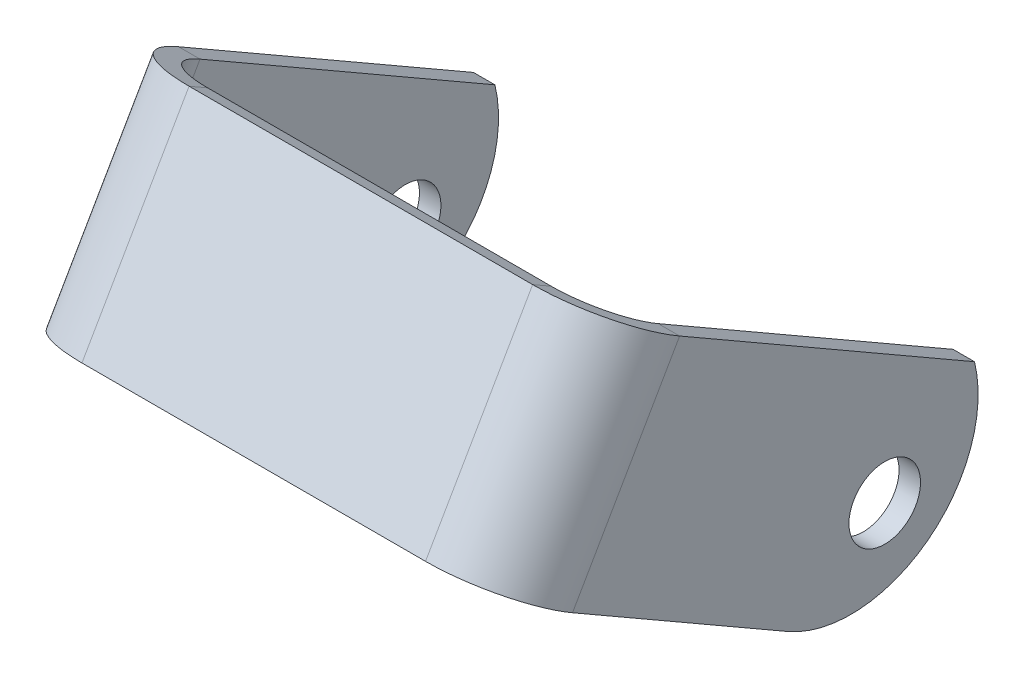
ISO-10303-21;
HEADER;
FILE_DESCRIPTION(('STEP AP214'),'2;1');
FILE_NAME('part.step','',(''),(''),'','','');
FILE_SCHEMA(('AUTOMOTIVE_DESIGN { 1 0 10303 214 1 1 1 1 }'));
ENDSEC;
DATA;
#1=APPLICATION_CONTEXT('core data for automotive mechanical design processes');
#2=APPLICATION_PROTOCOL_DEFINITION('international standard','automotive_design',2000,#1);
#3=PRODUCT_CONTEXT('',#1,'mechanical');
#4=PRODUCT('Part','Part','',(#3));
#5=PRODUCT_RELATED_PRODUCT_CATEGORY('part','',(#4));
#6=PRODUCT_DEFINITION_FORMATION('','',#4);
#7=PRODUCT_DEFINITION_CONTEXT('part definition',#1,'design');
#8=PRODUCT_DEFINITION('design','',#6,#7);
#9=PRODUCT_DEFINITION_SHAPE('','',#8);
#10=(LENGTH_UNIT() NAMED_UNIT(*) SI_UNIT(.MILLI.,.METRE.));
#11=(NAMED_UNIT(*) PLANE_ANGLE_UNIT() SI_UNIT($,.RADIAN.));
#12=(NAMED_UNIT(*) SI_UNIT($,.STERADIAN.) SOLID_ANGLE_UNIT());
#13=UNCERTAINTY_MEASURE_WITH_UNIT(LENGTH_MEASURE(1.E-05),#10,'distance_accuracy_value','');
#14=(GEOMETRIC_REPRESENTATION_CONTEXT(3) GLOBAL_UNCERTAINTY_ASSIGNED_CONTEXT((#13)) GLOBAL_UNIT_ASSIGNED_CONTEXT((#10,
#11,#12)) REPRESENTATION_CONTEXT('',''));
#15=CARTESIAN_POINT('',(0.,0.,0.));
#16=DIRECTION('',(0.,0.,1.));
#17=DIRECTION('',(1.,0.,0.));
#18=AXIS2_PLACEMENT_3D('',#15,#16,#17);
#19=CARTESIAN_POINT('',(17.5000000000001,-13.1983253106158,-48.8391520352316));
#20=DIRECTION('',(0.,0.866730126648501,-0.498777392791487));
#21=DIRECTION('',(0.,0.498777392791487,0.866730126648501));
#22=AXIS2_PLACEMENT_3D('',#19,#20,#21);
#23=PLANE('',#22);
#24=DIRECTION('',(1.,0.,0.));
#25=VECTOR('',#24,1.);
#26=CARTESIAN_POINT('',(-17.5000000000002,-4.38561215621674,-33.5252182065939));
#27=LINE('',#26,#25);
#28=CARTESIAN_POINT('',(16.0000000000001,-4.38561215621668,-33.5252182065938));
#29=VERTEX_POINT('',#28);
#30=CARTESIAN_POINT('',(17.5000000000001,-4.38561215621668,-33.5252182065938));
#31=VERTEX_POINT('',#30);
#32=EDGE_CURVE('E57',#29,#31,#27,.T.);
#33=ORIENTED_EDGE('',*,*,#32,.T.);
#34=DIRECTION('',(0.,-0.498777392791487,-0.866730126648501));
#35=VECTOR('',#34,1.);
#36=CARTESIAN_POINT('',(17.5000000000001,-13.1983253106158,-48.8391520352316));
#37=LINE('',#36,#35);
#38=CARTESIAN_POINT('',(17.5,4.25888343708619,-18.5035976025341));
#39=VERTEX_POINT('',#38);
#40=EDGE_CURVE('E180',#39,#31,#37,.T.);
#41=ORIENTED_EDGE('',*,*,#40,.F.);
#42=DIRECTION('',(1.,0.,0.));
#43=VECTOR('',#42,1.);
#44=CARTESIAN_POINT('',(16.,4.25888343708618,-18.5035976025341));
#45=LINE('',#44,#43);
#46=CARTESIAN_POINT('',(16.,4.25888343708618,-18.5035976025341));
#47=VERTEX_POINT('',#46);
#48=EDGE_CURVE('E255',#47,#39,#45,.T.);
#49=ORIENTED_EDGE('',*,*,#48,.F.);
#50=DIRECTION('',(0.,-0.498777392791487,-0.866730126648501));
#51=VECTOR('',#50,1.);
#52=CARTESIAN_POINT('',(16.0000000000001,-13.1983253106159,-48.8391520352316));
#53=LINE('',#52,#51);
#54=EDGE_CURVE('E172',#47,#29,#53,.T.);
#55=ORIENTED_EDGE('',*,*,#54,.T.);
#56=EDGE_LOOP('',(#33,#41,#49,#55));
#57=FACE_BOUND('',#56,.T.);
#58=ADVANCED_FACE('F39',(#57),#23,.F.);
#59=CARTESIAN_POINT('',(-17.5,6.25399300825214,-15.0366770959401));
#60=DIRECTION('',(0.,0.866730126648501,-0.498777392791487));
#61=DIRECTION('',(0.,0.498777392791487,0.866730126648501));
#62=AXIS2_PLACEMENT_3D('',#59,#60,#61);
#63=PLANE('',#62);
#64=CARTESIAN_POINT('',(-17.5000000000002,-4.38561215621674,-33.5252182065939));
#65=VERTEX_POINT('',#64);
#66=CARTESIAN_POINT('',(-16.0000000000001,-4.38561215621674,-33.5252182065939));
#67=VERTEX_POINT('',#66);
#68=EDGE_CURVE('E75',#65,#67,#27,.T.);
#69=ORIENTED_EDGE('',*,*,#68,.T.);
#70=DIRECTION('',(0.,0.498777392791487,0.866730126648501));
#71=VECTOR('',#70,1.);
#72=CARTESIAN_POINT('',(-16.,6.25399300825214,-15.0366770959401));
#73=LINE('',#72,#71);
#74=CARTESIAN_POINT('',(-16.,4.25888343708619,-18.5035976025341));
#75=VERTEX_POINT('',#74);
#76=EDGE_CURVE('E227',#67,#75,#73,.T.);
#77=ORIENTED_EDGE('',*,*,#76,.T.);
#78=DIRECTION('',(-1.,0.,0.));
#79=VECTOR('',#78,1.);
#80=CARTESIAN_POINT('',(-16.,4.25888343708619,-18.5035976025341));
#81=LINE('',#80,#79);
#82=CARTESIAN_POINT('',(-17.5,4.25888343708619,-18.5035976025341));
#83=VERTEX_POINT('',#82);
#84=EDGE_CURVE('E214',#75,#83,#81,.T.);
#85=ORIENTED_EDGE('',*,*,#84,.T.);
#86=DIRECTION('',(0.,0.498777392791487,0.866730126648501));
#87=VECTOR('',#86,1.);
#88=CARTESIAN_POINT('',(-17.5,6.25399300825214,-15.0366770959401));
#89=LINE('',#88,#87);
#90=EDGE_CURVE('E226',#65,#83,#89,.T.);
#91=ORIENTED_EDGE('',*,*,#90,.F.);
#92=EDGE_LOOP('',(#69,#77,#85,#91));
#93=FACE_BOUND('',#92,.T.);
#94=ADVANCED_FACE('F289',(#93),#63,.F.);
#95=CARTESIAN_POINT('',(-16.,19.2549449079796,-22.5183379878124));
#96=DIRECTION('',(0.,0.498777392791487,0.866730126648501));
#97=DIRECTION('',(0.,-0.866730126648501,0.498777392791487));
#98=AXIS2_PLACEMENT_3D('',#95,#96,#97);
#99=PLANE('',#98);
#100=DIRECTION('',(0.,0.866730126648501,-0.498777392791487));
#101=VECTOR('',#100,1.);
#102=CARTESIAN_POINT('',(-12.,19.2549449079796,-22.5183379878124));
#103=LINE('',#102,#101);
#104=CARTESIAN_POINT('',(-12.,19.2549449079796,-22.5183379878124));
#105=VERTEX_POINT('',#104);
#106=CARTESIAN_POINT('',(-12.,6.25399300825213,-15.0366770959401));
#107=VERTEX_POINT('',#106);
#108=EDGE_CURVE('E244',#105,#107,#103,.F.);
#109=ORIENTED_EDGE('',*,*,#108,.F.);
#110=DIRECTION('',(1.,0.,0.));
#111=VECTOR('',#110,1.);
#112=CARTESIAN_POINT('',(-16.,19.2549449079796,-22.5183379878124));
#113=LINE('',#112,#111);
#114=CARTESIAN_POINT('',(12.,19.2549449079796,-22.5183379878124));
#115=VERTEX_POINT('',#114);
#116=EDGE_CURVE('E183',#105,#115,#113,.T.);
#117=ORIENTED_EDGE('',*,*,#116,.T.);
#118=DIRECTION('',(0.,-0.866730126648502,0.498777392791486));
#119=VECTOR('',#118,1.);
#120=CARTESIAN_POINT('',(12.,6.25399300825212,-15.0366770959401));
#121=LINE('',#120,#119);
#122=CARTESIAN_POINT('',(12.,6.25399300825212,-15.0366770959401));
#123=VERTEX_POINT('',#122);
#124=EDGE_CURVE('E176',#123,#115,#121,.F.);
#125=ORIENTED_EDGE('',*,*,#124,.F.);
#126=DIRECTION('',(1.,0.,0.));
#127=VECTOR('',#126,1.);
#128=CARTESIAN_POINT('',(-16.,6.25399300825214,-15.0366770959401));
#129=LINE('',#128,#127);
#130=EDGE_CURVE('E49',#107,#123,#129,.T.);
#131=ORIENTED_EDGE('',*,*,#130,.F.);
#132=EDGE_LOOP('',(#109,#117,#125,#131));
#133=FACE_BOUND('',#132,.T.);
#134=ADVANCED_FACE('F322',(#133),#99,.F.);
#135=CARTESIAN_POINT('',(-16.,20.0031109971669,-21.2182427978396));
#136=DIRECTION('',(0.,0.498777392791487,0.866730126648501));
#137=DIRECTION('',(0.,-0.866730126648501,0.498777392791487));
#138=AXIS2_PLACEMENT_3D('',#135,#136,#137);
#139=PLANE('',#138);
#140=DIRECTION('',(1.,0.,0.));
#141=VECTOR('',#140,1.);
#142=CARTESIAN_POINT('',(-16.,20.0031109971669,-21.2182427978396));
#143=LINE('',#142,#141);
#144=CARTESIAN_POINT('',(-12.,20.0031109971669,-21.2182427978396));
#145=VERTEX_POINT('',#144);
#146=CARTESIAN_POINT('',(12.,20.0031109971669,-21.2182427978396));
#147=VERTEX_POINT('',#146);
#148=EDGE_CURVE('E154',#145,#147,#143,.T.);
#149=ORIENTED_EDGE('',*,*,#148,.F.);
#150=DIRECTION('',(0.,0.866730126648501,-0.498777392791487));
#151=VECTOR('',#150,1.);
#152=CARTESIAN_POINT('',(-12.,20.0031109971669,-21.2182427978396));
#153=LINE('',#152,#151);
#154=CARTESIAN_POINT('',(-12.,7.00215909743937,-13.7365819059673));
#155=VERTEX_POINT('',#154);
#156=EDGE_CURVE('E233',#145,#155,#153,.F.);
#157=ORIENTED_EDGE('',*,*,#156,.T.);
#158=DIRECTION('',(1.,0.,0.));
#159=VECTOR('',#158,1.);
#160=CARTESIAN_POINT('',(-16.,7.00215909743937,-13.7365819059673));
#161=LINE('',#160,#159);
#162=CARTESIAN_POINT('',(12.,7.00215909743935,-13.7365819059673));
#163=VERTEX_POINT('',#162);
#164=EDGE_CURVE('E162',#155,#163,#161,.T.);
#165=ORIENTED_EDGE('',*,*,#164,.T.);
#166=DIRECTION('',(0.,-0.866730126648502,0.498777392791486));
#167=VECTOR('',#166,1.);
#168=CARTESIAN_POINT('',(12.,7.00215909743935,-13.7365819059673));
#169=LINE('',#168,#167);
#170=EDGE_CURVE('E135',#163,#147,#169,.F.);
#171=ORIENTED_EDGE('',*,*,#170,.T.);
#172=EDGE_LOOP('',(#149,#157,#165,#171));
#173=FACE_BOUND('',#172,.T.);
#174=ADVANCED_FACE('F165',(#173),#139,.T.);
#175=CARTESIAN_POINT('',(-16.,19.2549449079796,-22.5183379878124));
#176=DIRECTION('',(0.,-0.866730126648501,0.498777392791487));
#177=DIRECTION('',(1.,0.,0.));
#178=AXIS2_PLACEMENT_3D('',#175,#176,#177);
#179=PLANE('',#178);
#180=ORIENTED_EDGE('',*,*,#116,.F.);
#181=DIRECTION('',(0.,0.498777392791487,0.866730126648501));
#182=VECTOR('',#181,1.);
#183=CARTESIAN_POINT('',(-12.,19.2549449079796,-22.5183379878124));
#184=LINE('',#183,#182);
#185=EDGE_CURVE('E159',#105,#145,#184,.T.);
#186=ORIENTED_EDGE('',*,*,#185,.T.);
#187=ORIENTED_EDGE('',*,*,#148,.T.);
#188=DIRECTION('',(0.,0.498777392791486,0.866730126648502));
#189=VECTOR('',#188,1.);
#190=CARTESIAN_POINT('',(12.,19.2549449079796,-22.5183379878124));
#191=LINE('',#190,#189);
#192=EDGE_CURVE('E146',#115,#147,#191,.T.);
#193=ORIENTED_EDGE('',*,*,#192,.F.);
#194=EDGE_LOOP('',(#180,#186,#187,#193));
#195=FACE_BOUND('',#194,.T.);
#196=ADVANCED_FACE('F158',(#195),#179,.F.);
#197=CARTESIAN_POINT('',(-16.,6.25399300825214,-15.0366770959401));
#198=DIRECTION('',(0.,-0.866730126648501,0.498777392791487));
#199=DIRECTION('',(1.,0.,0.));
#200=AXIS2_PLACEMENT_3D('',#197,#198,#199);
#201=PLANE('',#200);
#202=DIRECTION('',(0.,0.498777392791488,0.866730126648501));
#203=VECTOR('',#202,1.);
#204=CARTESIAN_POINT('',(-12.,6.25399300825213,-15.0366770959401));
#205=LINE('',#204,#203);
#206=EDGE_CURVE('E248',#107,#155,#205,.T.);
#207=ORIENTED_EDGE('',*,*,#206,.F.);
#208=ORIENTED_EDGE('',*,*,#130,.T.);
#209=DIRECTION('',(0.,0.498777392791486,0.866730126648502));
#210=VECTOR('',#209,1.);
#211=CARTESIAN_POINT('',(12.,6.25399300825212,-15.0366770959401));
#212=LINE('',#211,#210);
#213=EDGE_CURVE('E142',#123,#163,#212,.T.);
#214=ORIENTED_EDGE('',*,*,#213,.T.);
#215=ORIENTED_EDGE('',*,*,#164,.F.);
#216=EDGE_LOOP('',(#207,#208,#214,#215));
#217=FACE_BOUND('',#216,.T.);
#218=ADVANCED_FACE('F41',(#217),#201,.T.);
#219=CARTESIAN_POINT('',(12.,17.2598353368137,-25.9852584944064));
#220=DIRECTION('',(0.,0.866730126648502,-0.498777392791486));
#221=DIRECTION('',(0.,0.498777392791486,0.866730126648502));
#222=AXIS2_PLACEMENT_3D('',#219,#220,#221);
#223=PLANE('',#222);
#224=DIRECTION('',(1.,0.,0.));
#225=VECTOR('',#224,1.);
#226=CARTESIAN_POINT('',(16.,17.2598353368137,-25.9852584944064));
#227=LINE('',#226,#225);
#228=CARTESIAN_POINT('',(16.,17.2598353368137,-25.9852584944064));
#229=VERTEX_POINT('',#228);
#230=CARTESIAN_POINT('',(17.5,17.2598353368137,-25.9852584944064));
#231=VERTEX_POINT('',#230);
#232=EDGE_CURVE('E251',#229,#231,#227,.T.);
#233=ORIENTED_EDGE('',*,*,#232,.F.);
#234=CARTESIAN_POINT('',(12.,17.2598353368137,-25.9852584944064));
#235=DIRECTION('',(0.,-0.866730126648502,0.498777392791486));
#236=DIRECTION('',(0.,-0.498777392791486,-0.866730126648502));
#237=AXIS2_PLACEMENT_3D('',#234,#235,#236);
#238=CIRCLE('',#237,4.);
#239=EDGE_CURVE('E150',#115,#229,#238,.F.);
#240=ORIENTED_EDGE('',*,*,#239,.F.);
#241=ORIENTED_EDGE('',*,*,#192,.T.);
#242=CARTESIAN_POINT('',(12.,17.2598353368137,-25.9852584944064));
#243=DIRECTION('',(0.,-0.866730126648502,0.498777392791486));
#244=DIRECTION('',(0.,-0.498777392791486,-0.866730126648502));
#245=AXIS2_PLACEMENT_3D('',#242,#243,#244);
#246=CIRCLE('',#245,5.5);
#247=EDGE_CURVE('E131',#147,#231,#246,.F.);
#248=ORIENTED_EDGE('',*,*,#247,.T.);
#249=EDGE_LOOP('',(#233,#240,#241,#248));
#250=FACE_BOUND('',#249,.T.);
#251=ADVANCED_FACE('F148',(#250),#223,.T.);
#252=CARTESIAN_POINT('',(12.,4.25888343708618,-18.5035976025341));
#253=DIRECTION('',(0.,0.866730126648502,-0.498777392791486));
#254=DIRECTION('',(0.,0.498777392791486,0.866730126648502));
#255=AXIS2_PLACEMENT_3D('',#252,#253,#254);
#256=PLANE('',#255);
#257=CARTESIAN_POINT('',(12.,4.25888343708618,-18.5035976025341));
#258=DIRECTION('',(0.,-0.866730126648502,0.498777392791486));
#259=DIRECTION('',(0.,-0.498777392791486,-0.866730126648502));
#260=AXIS2_PLACEMENT_3D('',#257,#258,#259);
#261=CIRCLE('',#260,4.);
#262=EDGE_CURVE('E178',#47,#123,#261,.T.);
#263=ORIENTED_EDGE('',*,*,#262,.F.);
#264=ORIENTED_EDGE('',*,*,#48,.T.);
#265=CARTESIAN_POINT('',(12.,4.25888343708618,-18.5035976025341));
#266=DIRECTION('',(0.,-0.866730126648502,0.498777392791486));
#267=DIRECTION('',(0.,-0.498777392791486,-0.866730126648502));
#268=AXIS2_PLACEMENT_3D('',#265,#266,#267);
#269=CIRCLE('',#268,5.5);
#270=EDGE_CURVE('E168',#39,#163,#269,.T.);
#271=ORIENTED_EDGE('',*,*,#270,.T.);
#272=ORIENTED_EDGE('',*,*,#213,.F.);
#273=EDGE_LOOP('',(#263,#264,#271,#272));
#274=FACE_BOUND('',#273,.T.);
#275=ADVANCED_FACE('F318',(#274),#256,.F.);
#276=CARTESIAN_POINT('',(12.,4.25888343708617,-18.5035976025341));
#277=DIRECTION('',(0.,-0.866730126648502,0.498777392791486));
#278=DIRECTION('',(1.,0.,0.));
#279=AXIS2_PLACEMENT_3D('',#276,#277,#278);
#280=CYLINDRICAL_SURFACE('',#279,5.5);
#281=ORIENTED_EDGE('',*,*,#170,.F.);
#282=ORIENTED_EDGE('',*,*,#270,.F.);
#283=DIRECTION('',(0.,0.866730126648502,-0.498777392791486));
#284=VECTOR('',#283,1.);
#285=CARTESIAN_POINT('',(17.5,-6.93968474648737,-12.0591548978608));
#286=LINE('',#285,#284);
#287=EDGE_CURVE('E138',#39,#231,#286,.T.);
#288=ORIENTED_EDGE('',*,*,#287,.T.);
#289=ORIENTED_EDGE('',*,*,#247,.F.);
#290=EDGE_LOOP('',(#281,#282,#288,#289));
#291=FACE_BOUND('',#290,.T.);
#292=ADVANCED_FACE('F133',(#291),#280,.T.);
#293=CARTESIAN_POINT('',(12.,4.25888343708617,-18.5035976025341));
#294=DIRECTION('',(0.,-0.866730126648502,0.498777392791486));
#295=DIRECTION('',(1.,0.,0.));
#296=AXIS2_PLACEMENT_3D('',#293,#294,#295);
#297=CYLINDRICAL_SURFACE('',#296,4.);
#298=ORIENTED_EDGE('',*,*,#124,.T.);
#299=ORIENTED_EDGE('',*,*,#239,.T.);
#300=DIRECTION('',(0.,-0.866730126648501,0.498777392791486));
#301=VECTOR('',#300,1.);
#302=CARTESIAN_POINT('',(16.,17.2598353368137,-25.9852584944064));
#303=LINE('',#302,#301);
#304=EDGE_CURVE('E253',#229,#47,#303,.T.);
#305=ORIENTED_EDGE('',*,*,#304,.T.);
#306=ORIENTED_EDGE('',*,*,#262,.T.);
#307=EDGE_LOOP('',(#298,#299,#305,#306));
#308=FACE_BOUND('',#307,.T.);
#309=ADVANCED_FACE('F320',(#308),#297,.F.);
#310=CARTESIAN_POINT('',(17.5,19.2549449079796,-22.5183379878124));
#311=DIRECTION('',(0.,-0.866730126648501,0.498777392791487));
#312=DIRECTION('',(0.,-0.498777392791487,-0.866730126648501));
#313=AXIS2_PLACEMENT_3D('',#310,#311,#312);
#314=PLANE('',#313);
#315=DIRECTION('',(0.,0.498777392791487,0.866730126648501));
#316=VECTOR('',#315,1.);
#317=CARTESIAN_POINT('',(17.5,19.2549449079796,-22.5183379878124));
#318=LINE('',#317,#316);
#319=CARTESIAN_POINT('',(17.5000000000001,5.40620403509819,-46.58342414478));
#320=VERTEX_POINT('',#319);
#321=EDGE_CURVE('E261',#320,#231,#318,.T.);
#322=ORIENTED_EDGE('',*,*,#321,.F.);
#323=DIRECTION('',(1.,0.,0.));
#324=VECTOR('',#323,1.);
#325=CARTESIAN_POINT('',(-17.5000000000002,5.40620403509812,-46.5834241447801));
#326=LINE('',#325,#324);
#327=CARTESIAN_POINT('',(16.0000000000001,5.40620403509818,-46.58342414478));
#328=VERTEX_POINT('',#327);
#329=EDGE_CURVE('E66',#328,#320,#326,.T.);
#330=ORIENTED_EDGE('',*,*,#329,.F.);
#331=DIRECTION('',(0.,0.498777392791487,0.866730126648501));
#332=VECTOR('',#331,1.);
#333=CARTESIAN_POINT('',(16.,19.2549449079796,-22.5183379878124));
#334=LINE('',#333,#332);
#335=EDGE_CURVE('E260',#328,#229,#334,.T.);
#336=ORIENTED_EDGE('',*,*,#335,.T.);
#337=ORIENTED_EDGE('',*,*,#232,.T.);
#338=EDGE_LOOP('',(#322,#330,#336,#337));
#339=FACE_BOUND('',#338,.T.);
#340=ADVANCED_FACE('F277',(#339),#314,.F.);
#341=CARTESIAN_POINT('',(17.5,0.,0.));
#342=DIRECTION('',(-1.,0.,0.));
#343=DIRECTION('',(0.,0.,1.));
#344=AXIS2_PLACEMENT_3D('',#341,#342,#343);
#345=PLANE('',#344);
#346=CARTESIAN_POINT('',(17.5000000000001,0.,-40.3124294068874));
#347=DIRECTION('',(-1.,0.,0.));
#348=DIRECTION('',(0.,0.,1.));
#349=AXIS2_PLACEMENT_3D('',#346,#347,#348);
#350=CIRCLE('',#349,2.5);
#351=CARTESIAN_POINT('',(17.5000000000001,0.,-37.8124294068874));
#352=VERTEX_POINT('',#351);
#353=EDGE_CURVE('E195',#352,#352,#350,.T.);
#354=ORIENTED_EDGE('',*,*,#353,.T.);
#355=EDGE_LOOP('',(#354));
#356=FACE_BOUND('',#355,.T.);
#357=ORIENTED_EDGE('',*,*,#40,.T.);
#358=CARTESIAN_POINT('',(17.5000000000001,3.31084755289087,-37.9543017118338));
#359=DIRECTION('',(1.,0.,0.));
#360=DIRECTION('',(0.,0.,-1.));
#361=AXIS2_PLACEMENT_3D('',#358,#359,#360);
#362=CIRCLE('',#361,8.87988022161922);
#363=EDGE_CURVE('E43',#320,#31,#362,.F.);
#364=ORIENTED_EDGE('',*,*,#363,.F.);
#365=ORIENTED_EDGE('',*,*,#321,.T.);
#366=ORIENTED_EDGE('',*,*,#287,.F.);
#367=EDGE_LOOP('',(#357,#364,#365,#366));
#368=FACE_BOUND('',#367,.T.);
#369=ADVANCED_FACE('F341',(#356,#368),#345,.F.);
#370=CARTESIAN_POINT('',(16.,0.,0.));
#371=DIRECTION('',(-1.,0.,0.));
#372=DIRECTION('',(0.,0.,1.));
#373=AXIS2_PLACEMENT_3D('',#370,#371,#372);
#374=PLANE('',#373);
#375=CARTESIAN_POINT('',(16.0000000000001,3.31084755289087,-37.9543017118338));
#376=DIRECTION('',(-1.,0.,0.));
#377=DIRECTION('',(0.,0.,1.));
#378=AXIS2_PLACEMENT_3D('',#375,#376,#377);
#379=CIRCLE('',#378,8.87988022161922);
#380=EDGE_CURVE('E209',#29,#328,#379,.F.);
#381=ORIENTED_EDGE('',*,*,#380,.F.);
#382=ORIENTED_EDGE('',*,*,#54,.F.);
#383=ORIENTED_EDGE('',*,*,#304,.F.);
#384=ORIENTED_EDGE('',*,*,#335,.F.);
#385=EDGE_LOOP('',(#381,#382,#383,#384));
#386=FACE_BOUND('',#385,.T.);
#387=CARTESIAN_POINT('',(16.0000000000001,0.,-40.3124294068874));
#388=DIRECTION('',(-1.,0.,0.));
#389=DIRECTION('',(0.,0.,1.));
#390=AXIS2_PLACEMENT_3D('',#387,#388,#389);
#391=CIRCLE('',#390,2.5);
#392=CARTESIAN_POINT('',(16.0000000000001,0.,-37.8124294068874));
#393=VERTEX_POINT('',#392);
#394=EDGE_CURVE('E190',#393,#393,#391,.T.);
#395=ORIENTED_EDGE('',*,*,#394,.F.);
#396=EDGE_LOOP('',(#395));
#397=FACE_BOUND('',#396,.T.);
#398=ADVANCED_FACE('F273',(#386,#397),#374,.T.);
#399=CARTESIAN_POINT('',(-12.,4.25888343708619,-18.5035976025341));
#400=DIRECTION('',(0.,-0.866730126648501,0.498777392791487));
#401=DIRECTION('',(0.,-0.498777392791487,-0.866730126648501));
#402=AXIS2_PLACEMENT_3D('',#399,#400,#401);
#403=PLANE('',#402);
#404=ORIENTED_EDGE('',*,*,#84,.F.);
#405=CARTESIAN_POINT('',(-12.,4.25888343708619,-18.5035976025341));
#406=DIRECTION('',(0.,0.866730126648501,-0.498777392791487));
#407=DIRECTION('',(0.,0.498777392791487,0.866730126648501));
#408=AXIS2_PLACEMENT_3D('',#405,#406,#407);
#409=CIRCLE('',#408,4.);
#410=EDGE_CURVE('E241',#107,#75,#409,.F.);
#411=ORIENTED_EDGE('',*,*,#410,.F.);
#412=ORIENTED_EDGE('',*,*,#206,.T.);
#413=CARTESIAN_POINT('',(-12.,4.25888343708618,-18.5035976025341));
#414=DIRECTION('',(0.,0.866730126648501,-0.498777392791487));
#415=DIRECTION('',(0.,0.498777392791487,0.866730126648501));
#416=AXIS2_PLACEMENT_3D('',#413,#414,#415);
#417=CIRCLE('',#416,5.5);
#418=EDGE_CURVE('E235',#155,#83,#417,.F.);
#419=ORIENTED_EDGE('',*,*,#418,.T.);
#420=EDGE_LOOP('',(#404,#411,#412,#419));
#421=FACE_BOUND('',#420,.T.);
#422=ADVANCED_FACE('F294',(#421),#403,.T.);
#423=CARTESIAN_POINT('',(-12.,17.2598353368137,-25.9852584944064));
#424=DIRECTION('',(0.,-0.866730126648501,0.498777392791487));
#425=DIRECTION('',(0.,-0.498777392791487,-0.866730126648501));
#426=AXIS2_PLACEMENT_3D('',#423,#424,#425);
#427=PLANE('',#426);
#428=CARTESIAN_POINT('',(-12.,17.2598353368137,-25.9852584944064));
#429=DIRECTION('',(0.,0.866730126648501,-0.498777392791487));
#430=DIRECTION('',(0.,0.498777392791487,0.866730126648501));
#431=AXIS2_PLACEMENT_3D('',#428,#429,#430);
#432=CIRCLE('',#431,4.);
#433=CARTESIAN_POINT('',(-16.,17.2598353368137,-25.9852584944064));
#434=VERTEX_POINT('',#433);
#435=EDGE_CURVE('E229',#434,#105,#432,.T.);
#436=ORIENTED_EDGE('',*,*,#435,.F.);
#437=DIRECTION('',(-1.,0.,0.));
#438=VECTOR('',#437,1.);
#439=CARTESIAN_POINT('',(-16.,17.2598353368137,-25.9852584944064));
#440=LINE('',#439,#438);
#441=CARTESIAN_POINT('',(-17.5,17.2598353368137,-25.9852584944064));
#442=VERTEX_POINT('',#441);
#443=EDGE_CURVE('E213',#434,#442,#440,.T.);
#444=ORIENTED_EDGE('',*,*,#443,.T.);
#445=CARTESIAN_POINT('',(-12.,17.2598353368137,-25.9852584944064));
#446=DIRECTION('',(0.,0.866730126648501,-0.498777392791487));
#447=DIRECTION('',(0.,0.498777392791487,0.866730126648501));
#448=AXIS2_PLACEMENT_3D('',#445,#446,#447);
#449=CIRCLE('',#448,5.5);
#450=EDGE_CURVE('E236',#442,#145,#449,.T.);
#451=ORIENTED_EDGE('',*,*,#450,.T.);
#452=ORIENTED_EDGE('',*,*,#185,.F.);
#453=EDGE_LOOP('',(#436,#444,#451,#452));
#454=FACE_BOUND('',#453,.T.);
#455=ADVANCED_FACE('F310',(#454),#427,.F.);
#456=CARTESIAN_POINT('',(-12.,17.2598353368137,-25.9852584944064));
#457=DIRECTION('',(0.,0.866730126648501,-0.498777392791487));
#458=DIRECTION('',(-1.,0.,0.));
#459=AXIS2_PLACEMENT_3D('',#456,#457,#458);
#460=CYLINDRICAL_SURFACE('',#459,5.5);
#461=ORIENTED_EDGE('',*,*,#156,.F.);
#462=ORIENTED_EDGE('',*,*,#450,.F.);
#463=DIRECTION('',(0.,-0.866730126648501,0.498777392791487));
#464=VECTOR('',#463,1.);
#465=CARTESIAN_POINT('',(-17.5,-6.93968474648737,-12.0591548978607));
#466=LINE('',#465,#464);
#467=EDGE_CURVE('E217',#442,#83,#466,.T.);
#468=ORIENTED_EDGE('',*,*,#467,.T.);
#469=ORIENTED_EDGE('',*,*,#418,.F.);
#470=EDGE_LOOP('',(#461,#462,#468,#469));
#471=FACE_BOUND('',#470,.T.);
#472=ADVANCED_FACE('F312',(#471),#460,.T.);
#473=CARTESIAN_POINT('',(-12.,17.2598353368137,-25.9852584944064));
#474=DIRECTION('',(0.,0.866730126648501,-0.498777392791487));
#475=DIRECTION('',(-1.,0.,0.));
#476=AXIS2_PLACEMENT_3D('',#473,#474,#475);
#477=CYLINDRICAL_SURFACE('',#476,4.);
#478=ORIENTED_EDGE('',*,*,#108,.T.);
#479=ORIENTED_EDGE('',*,*,#410,.T.);
#480=DIRECTION('',(0.,0.866730126648501,-0.498777392791487));
#481=VECTOR('',#480,1.);
#482=CARTESIAN_POINT('',(-16.,4.25888343708619,-18.5035976025341));
#483=LINE('',#482,#481);
#484=EDGE_CURVE('E211',#75,#434,#483,.T.);
#485=ORIENTED_EDGE('',*,*,#484,.T.);
#486=ORIENTED_EDGE('',*,*,#435,.T.);
#487=EDGE_LOOP('',(#478,#479,#485,#486));
#488=FACE_BOUND('',#487,.T.);
#489=ADVANCED_FACE('F298',(#488),#477,.F.);
#490=CARTESIAN_POINT('',(-17.5000000000001,-0.197373410888348,-56.3208129271039));
#491=DIRECTION('',(0.,-0.866730126648501,0.498777392791487));
#492=DIRECTION('',(0.,-0.498777392791487,-0.866730126648501));
#493=AXIS2_PLACEMENT_3D('',#490,#491,#492);
#494=PLANE('',#493);
#495=DIRECTION('',(0.,-0.498777392791487,-0.866730126648501));
#496=VECTOR('',#495,1.);
#497=CARTESIAN_POINT('',(-16.0000000000001,-0.197373410888351,-56.3208129271039));
#498=LINE('',#497,#496);
#499=CARTESIAN_POINT('',(-16.0000000000001,5.40620403509814,-46.5834241447801));
#500=VERTEX_POINT('',#499);
#501=EDGE_CURVE('E222',#434,#500,#498,.T.);
#502=ORIENTED_EDGE('',*,*,#501,.T.);
#503=CARTESIAN_POINT('',(-17.5000000000002,5.40620403509812,-46.5834241447801));
#504=VERTEX_POINT('',#503);
#505=EDGE_CURVE('E198',#504,#500,#326,.T.);
#506=ORIENTED_EDGE('',*,*,#505,.F.);
#507=DIRECTION('',(0.,-0.498777392791487,-0.866730126648501));
#508=VECTOR('',#507,1.);
#509=CARTESIAN_POINT('',(-17.5000000000001,-0.197373410888348,-56.3208129271039));
#510=LINE('',#509,#508);
#511=EDGE_CURVE('E223',#442,#504,#510,.T.);
#512=ORIENTED_EDGE('',*,*,#511,.F.);
#513=ORIENTED_EDGE('',*,*,#443,.F.);
#514=EDGE_LOOP('',(#502,#506,#512,#513));
#515=FACE_BOUND('',#514,.T.);
#516=ADVANCED_FACE('F308',(#515),#494,.F.);
#517=CARTESIAN_POINT('',(-17.5,0.,0.));
#518=DIRECTION('',(1.,0.,0.));
#519=DIRECTION('',(0.,0.,-1.));
#520=AXIS2_PLACEMENT_3D('',#517,#518,#519);
#521=PLANE('',#520);
#522=CARTESIAN_POINT('',(-17.5000000000002,0.,-40.3124294068875));
#523=DIRECTION('',(1.,0.,0.));
#524=DIRECTION('',(0.,0.,-1.));
#525=AXIS2_PLACEMENT_3D('',#522,#523,#524);
#526=CIRCLE('',#525,2.5);
#527=CARTESIAN_POINT('',(-17.5000000000002,0.,-42.8124294068875));
#528=VERTEX_POINT('',#527);
#529=EDGE_CURVE('E191',#528,#528,#526,.T.);
#530=ORIENTED_EDGE('',*,*,#529,.T.);
#531=EDGE_LOOP('',(#530));
#532=FACE_BOUND('',#531,.T.);
#533=ORIENTED_EDGE('',*,*,#511,.T.);
#534=CARTESIAN_POINT('',(-17.5000000000002,3.31084755289081,-37.9543017118339));
#535=DIRECTION('',(-1.,0.,0.));
#536=DIRECTION('',(0.,0.,-1.));
#537=AXIS2_PLACEMENT_3D('',#534,#535,#536);
#538=CIRCLE('',#537,8.87988022161922);
#539=EDGE_CURVE('E281',#504,#65,#538,.T.);
#540=ORIENTED_EDGE('',*,*,#539,.T.);
#541=ORIENTED_EDGE('',*,*,#90,.T.);
#542=ORIENTED_EDGE('',*,*,#467,.F.);
#543=EDGE_LOOP('',(#533,#540,#541,#542));
#544=FACE_BOUND('',#543,.T.);
#545=ADVANCED_FACE('F284',(#532,#544),#521,.F.);
#546=CARTESIAN_POINT('',(-16.,0.,0.));
#547=DIRECTION('',(1.,0.,0.));
#548=DIRECTION('',(0.,0.,-1.));
#549=AXIS2_PLACEMENT_3D('',#546,#547,#548);
#550=PLANE('',#549);
#551=CARTESIAN_POINT('',(-16.0000000000001,3.31084755289081,-37.9543017118338));
#552=DIRECTION('',(1.,0.,0.));
#553=DIRECTION('',(0.,0.,-1.));
#554=AXIS2_PLACEMENT_3D('',#551,#552,#553);
#555=CIRCLE('',#554,8.87988022161922);
#556=EDGE_CURVE('E11',#500,#67,#555,.F.);
#557=ORIENTED_EDGE('',*,*,#556,.F.);
#558=ORIENTED_EDGE('',*,*,#501,.F.);
#559=ORIENTED_EDGE('',*,*,#484,.F.);
#560=ORIENTED_EDGE('',*,*,#76,.F.);
#561=EDGE_LOOP('',(#557,#558,#559,#560));
#562=FACE_BOUND('',#561,.T.);
#563=CARTESIAN_POINT('',(-16.0000000000001,0.,-40.3124294068875));
#564=DIRECTION('',(1.,0.,0.));
#565=DIRECTION('',(0.,0.,-1.));
#566=AXIS2_PLACEMENT_3D('',#563,#564,#565);
#567=CIRCLE('',#566,2.5);
#568=CARTESIAN_POINT('',(-16.0000000000001,0.,-42.8124294068875));
#569=VERTEX_POINT('',#568);
#570=EDGE_CURVE('E188',#569,#569,#567,.T.);
#571=ORIENTED_EDGE('',*,*,#570,.F.);
#572=EDGE_LOOP('',(#571));
#573=FACE_BOUND('',#572,.T.);
#574=ADVANCED_FACE('F304',(#562,#573),#550,.T.);
#575=CARTESIAN_POINT('',(-17.5000000000002,0.,-40.3124294068875));
#576=DIRECTION('',(1.,0.,0.));
#577=DIRECTION('',(0.,0.,-1.));
#578=AXIS2_PLACEMENT_3D('',#575,#576,#577);
#579=CYLINDRICAL_SURFACE('',#578,2.5);
#580=ORIENTED_EDGE('',*,*,#570,.T.);
#581=EDGE_LOOP('',(#580));
#582=FACE_BOUND('',#581,.T.);
#583=ORIENTED_EDGE('',*,*,#529,.F.);
#584=EDGE_LOOP('',(#583));
#585=FACE_BOUND('',#584,.T.);
#586=ADVANCED_FACE('F419',(#582,#585),#579,.F.);
#587=CARTESIAN_POINT('',(-17.5000000000002,3.31084755289081,-37.9543017118339));
#588=DIRECTION('',(1.,0.,0.));
#589=DIRECTION('',(0.,0.,-1.));
#590=AXIS2_PLACEMENT_3D('',#587,#588,#589);
#591=CYLINDRICAL_SURFACE('',#590,8.87988022161922);
#592=ORIENTED_EDGE('',*,*,#556,.T.);
#593=ORIENTED_EDGE('',*,*,#68,.F.);
#594=ORIENTED_EDGE('',*,*,#539,.F.);
#595=ORIENTED_EDGE('',*,*,#505,.T.);
#596=EDGE_LOOP('',(#592,#593,#594,#595));
#597=FACE_BOUND('',#596,.T.);
#598=ADVANCED_FACE('F426',(#597),#591,.T.);
#599=ORIENTED_EDGE('',*,*,#394,.T.);
#600=EDGE_LOOP('',(#599));
#601=FACE_BOUND('',#600,.T.);
#602=ORIENTED_EDGE('',*,*,#353,.F.);
#603=EDGE_LOOP('',(#602));
#604=FACE_BOUND('',#603,.T.);
#605=ADVANCED_FACE('F428',(#601,#604),#579,.F.);
#606=ORIENTED_EDGE('',*,*,#32,.F.);
#607=ORIENTED_EDGE('',*,*,#380,.T.);
#608=ORIENTED_EDGE('',*,*,#329,.T.);
#609=ORIENTED_EDGE('',*,*,#363,.T.);
#610=EDGE_LOOP('',(#606,#607,#608,#609));
#611=FACE_BOUND('',#610,.T.);
#612=ADVANCED_FACE('F275',(#611),#591,.T.);
#613=CLOSED_SHELL('',(#58,#94,#134,#174,#196,#218,#251,#275,#292,#309,#340,#369,#398,#422,#455,
#472,#489,#516,#545,#574,#586,#598,#605,#612));
#614=MANIFOLD_SOLID_BREP('B2',#613);
#615=ADVANCED_BREP_SHAPE_REPRESENTATION('',(#18,#614),#14);
#616=SHAPE_DEFINITION_REPRESENTATION(#9,#615);
ENDSEC;
END-ISO-10303-21;
